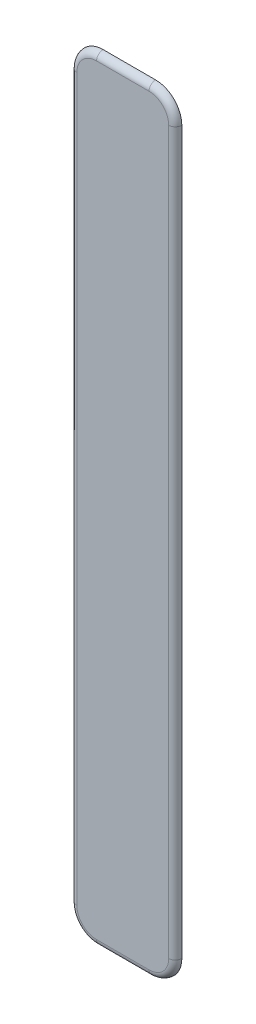
ISO-10303-21;
HEADER;
FILE_DESCRIPTION(('STEP AP214'),'2;1');
FILE_NAME('part.step','',(''),(''),'','','');
FILE_SCHEMA(('AUTOMOTIVE_DESIGN { 1 0 10303 214 1 1 1 1 }'));
ENDSEC;
DATA;
#1=APPLICATION_CONTEXT('core data for automotive mechanical design processes');
#2=APPLICATION_PROTOCOL_DEFINITION('international standard','automotive_design',2000,#1);
#3=PRODUCT_CONTEXT('',#1,'mechanical');
#4=PRODUCT('Part','Part','',(#3));
#5=PRODUCT_RELATED_PRODUCT_CATEGORY('part','',(#4));
#6=PRODUCT_DEFINITION_FORMATION('','',#4);
#7=PRODUCT_DEFINITION_CONTEXT('part definition',#1,'design');
#8=PRODUCT_DEFINITION('design','',#6,#7);
#9=PRODUCT_DEFINITION_SHAPE('','',#8);
#10=(LENGTH_UNIT() NAMED_UNIT(*) SI_UNIT(.MILLI.,.METRE.));
#11=(NAMED_UNIT(*) PLANE_ANGLE_UNIT() SI_UNIT($,.RADIAN.));
#12=(NAMED_UNIT(*) SI_UNIT($,.STERADIAN.) SOLID_ANGLE_UNIT());
#13=UNCERTAINTY_MEASURE_WITH_UNIT(LENGTH_MEASURE(1.E-05),#10,'distance_accuracy_value','');
#14=(GEOMETRIC_REPRESENTATION_CONTEXT(3) GLOBAL_UNCERTAINTY_ASSIGNED_CONTEXT((#13)) GLOBAL_UNIT_ASSIGNED_CONTEXT((#10,
#11,#12)) REPRESENTATION_CONTEXT('',''));
#15=CARTESIAN_POINT('',(0.,0.,0.));
#16=DIRECTION('',(0.,0.,1.));
#17=DIRECTION('',(1.,0.,0.));
#18=AXIS2_PLACEMENT_3D('',#15,#16,#17);
#19=CARTESIAN_POINT('',(0.,0.,1.));
#20=DIRECTION('',(0.,0.,-1.));
#21=DIRECTION('',(-1.,0.,0.));
#22=AXIS2_PLACEMENT_3D('',#19,#20,#21);
#23=PLANE('',#22);
#24=DIRECTION('',(-1.,0.,0.));
#25=VECTOR('',#24,1.);
#26=CARTESIAN_POINT('',(0.,117.,1.));
#27=LINE('',#26,#25);
#28=CARTESIAN_POINT('',(12.,117.,1.));
#29=VERTEX_POINT('',#28);
#30=CARTESIAN_POINT('',(4.,117.,1.));
#31=VERTEX_POINT('',#30);
#32=EDGE_CURVE('E44',#29,#31,#27,.T.);
#33=ORIENTED_EDGE('',*,*,#32,.T.);
#34=CARTESIAN_POINT('',(4.,114.,1.));
#35=DIRECTION('',(0.,0.,-1.));
#36=DIRECTION('',(-1.,0.,0.));
#37=AXIS2_PLACEMENT_3D('',#34,#35,#36);
#38=CIRCLE('',#37,3.);
#39=CARTESIAN_POINT('',(1.,114.,1.));
#40=VERTEX_POINT('',#39);
#41=EDGE_CURVE('E11',#31,#40,#38,.F.);
#42=ORIENTED_EDGE('',*,*,#41,.T.);
#43=DIRECTION('',(0.,-1.,0.));
#44=VECTOR('',#43,1.);
#45=CARTESIAN_POINT('',(1.,0.,1.));
#46=LINE('',#45,#44);
#47=CARTESIAN_POINT('',(1.,4.,1.));
#48=VERTEX_POINT('',#47);
#49=EDGE_CURVE('E127',#40,#48,#46,.T.);
#50=ORIENTED_EDGE('',*,*,#49,.T.);
#51=CARTESIAN_POINT('',(4.,4.,1.));
#52=DIRECTION('',(0.,0.,-1.));
#53=DIRECTION('',(-1.,0.,0.));
#54=AXIS2_PLACEMENT_3D('',#51,#52,#53);
#55=CIRCLE('',#54,3.);
#56=CARTESIAN_POINT('',(4.,1.,1.));
#57=VERTEX_POINT('',#56);
#58=EDGE_CURVE('E129',#48,#57,#55,.F.);
#59=ORIENTED_EDGE('',*,*,#58,.T.);
#60=DIRECTION('',(1.,0.,0.));
#61=VECTOR('',#60,1.);
#62=CARTESIAN_POINT('',(0.,1.,1.));
#63=LINE('',#62,#61);
#64=CARTESIAN_POINT('',(12.,1.,1.));
#65=VERTEX_POINT('',#64);
#66=EDGE_CURVE('E117',#57,#65,#63,.T.);
#67=ORIENTED_EDGE('',*,*,#66,.T.);
#68=CARTESIAN_POINT('',(12.,4.,1.));
#69=DIRECTION('',(0.,0.,-1.));
#70=DIRECTION('',(-1.,0.,0.));
#71=AXIS2_PLACEMENT_3D('',#68,#69,#70);
#72=CIRCLE('',#71,3.);
#73=CARTESIAN_POINT('',(15.,4.,1.));
#74=VERTEX_POINT('',#73);
#75=EDGE_CURVE('E137',#65,#74,#72,.F.);
#76=ORIENTED_EDGE('',*,*,#75,.T.);
#77=DIRECTION('',(0.,1.,0.));
#78=VECTOR('',#77,1.);
#79=CARTESIAN_POINT('',(15.,0.,1.));
#80=LINE('',#79,#78);
#81=CARTESIAN_POINT('',(15.,114.,1.));
#82=VERTEX_POINT('',#81);
#83=EDGE_CURVE('E139',#74,#82,#80,.T.);
#84=ORIENTED_EDGE('',*,*,#83,.T.);
#85=CARTESIAN_POINT('',(12.,114.,1.));
#86=DIRECTION('',(0.,0.,-1.));
#87=DIRECTION('',(-1.,0.,0.));
#88=AXIS2_PLACEMENT_3D('',#85,#86,#87);
#89=CIRCLE('',#88,3.);
#90=EDGE_CURVE('E55',#82,#29,#89,.F.);
#91=ORIENTED_EDGE('',*,*,#90,.T.);
#92=EDGE_LOOP('',(#33,#42,#50,#59,#67,#76,#84,#91));
#93=FACE_BOUND('',#92,.T.);
#94=ADVANCED_FACE('F35',(#93),#23,.F.);
#95=CARTESIAN_POINT('',(0.,0.,0.));
#96=DIRECTION('',(0.,0.,-1.));
#97=DIRECTION('',(-1.,0.,0.));
#98=AXIS2_PLACEMENT_3D('',#95,#96,#97);
#99=PLANE('',#98);
#100=DIRECTION('',(1.,0.,0.));
#101=VECTOR('',#100,1.);
#102=CARTESIAN_POINT('',(0.,0.,0.));
#103=LINE('',#102,#101);
#104=CARTESIAN_POINT('',(4.,0.,0.));
#105=VERTEX_POINT('',#104);
#106=CARTESIAN_POINT('',(12.,0.,0.));
#107=VERTEX_POINT('',#106);
#108=EDGE_CURVE('E99',#105,#107,#103,.T.);
#109=ORIENTED_EDGE('',*,*,#108,.F.);
#110=CARTESIAN_POINT('',(4.,4.,0.));
#111=DIRECTION('',(0.,0.,-1.));
#112=DIRECTION('',(-1.,0.,0.));
#113=AXIS2_PLACEMENT_3D('',#110,#111,#112);
#114=CIRCLE('',#113,4.);
#115=CARTESIAN_POINT('',(0.,4.,0.));
#116=VERTEX_POINT('',#115);
#117=EDGE_CURVE('E103',#105,#116,#114,.T.);
#118=ORIENTED_EDGE('',*,*,#117,.T.);
#119=DIRECTION('',(0.,-1.,0.));
#120=VECTOR('',#119,1.);
#121=CARTESIAN_POINT('',(0.,0.,0.));
#122=LINE('',#121,#120);
#123=CARTESIAN_POINT('',(0.,114.,0.));
#124=VERTEX_POINT('',#123);
#125=EDGE_CURVE('E111',#124,#116,#122,.T.);
#126=ORIENTED_EDGE('',*,*,#125,.F.);
#127=CARTESIAN_POINT('',(4.,114.,0.));
#128=DIRECTION('',(0.,0.,-1.));
#129=DIRECTION('',(-1.,0.,0.));
#130=AXIS2_PLACEMENT_3D('',#127,#128,#129);
#131=CIRCLE('',#130,4.);
#132=CARTESIAN_POINT('',(4.,118.,0.));
#133=VERTEX_POINT('',#132);
#134=EDGE_CURVE('E131',#124,#133,#131,.T.);
#135=ORIENTED_EDGE('',*,*,#134,.T.);
#136=DIRECTION('',(-1.,0.,0.));
#137=VECTOR('',#136,1.);
#138=CARTESIAN_POINT('',(0.,118.,0.));
#139=LINE('',#138,#137);
#140=CARTESIAN_POINT('',(12.,118.,0.));
#141=VERTEX_POINT('',#140);
#142=EDGE_CURVE('E162',#141,#133,#139,.T.);
#143=ORIENTED_EDGE('',*,*,#142,.F.);
#144=CARTESIAN_POINT('',(12.,114.,0.));
#145=DIRECTION('',(0.,0.,-1.));
#146=DIRECTION('',(-1.,0.,0.));
#147=AXIS2_PLACEMENT_3D('',#144,#145,#146);
#148=CIRCLE('',#147,4.);
#149=CARTESIAN_POINT('',(16.,114.,0.));
#150=VERTEX_POINT('',#149);
#151=EDGE_CURVE('E165',#141,#150,#148,.T.);
#152=ORIENTED_EDGE('',*,*,#151,.T.);
#153=DIRECTION('',(0.,1.,0.));
#154=VECTOR('',#153,1.);
#155=CARTESIAN_POINT('',(16.,0.,0.));
#156=LINE('',#155,#154);
#157=CARTESIAN_POINT('',(16.,4.,0.));
#158=VERTEX_POINT('',#157);
#159=EDGE_CURVE('E110',#158,#150,#156,.T.);
#160=ORIENTED_EDGE('',*,*,#159,.F.);
#161=CARTESIAN_POINT('',(12.,4.,0.));
#162=DIRECTION('',(0.,0.,-1.));
#163=DIRECTION('',(-1.,0.,0.));
#164=AXIS2_PLACEMENT_3D('',#161,#162,#163);
#165=CIRCLE('',#164,4.);
#166=EDGE_CURVE('E106',#158,#107,#165,.T.);
#167=ORIENTED_EDGE('',*,*,#166,.T.);
#168=EDGE_LOOP('',(#109,#118,#126,#135,#143,#152,#160,#167));
#169=FACE_BOUND('',#168,.T.);
#170=ADVANCED_FACE('F101',(#169),#99,.T.);
#171=CARTESIAN_POINT('',(12.,4.,0.));
#172=DIRECTION('',(0.,0.,-1.));
#173=DIRECTION('',(-1.,0.,0.));
#174=AXIS2_PLACEMENT_3D('',#171,#172,#173);
#175=TOROIDAL_SURFACE('',#174,3.,1.);
#176=CARTESIAN_POINT('',(12.,1.,0.));
#177=DIRECTION('',(-1.,0.,0.));
#178=DIRECTION('',(0.,0.,1.));
#179=AXIS2_PLACEMENT_3D('',#176,#177,#178);
#180=CIRCLE('',#179,1.);
#181=EDGE_CURVE('E151',#107,#65,#180,.T.);
#182=ORIENTED_EDGE('',*,*,#181,.F.);
#183=ORIENTED_EDGE('',*,*,#166,.F.);
#184=CARTESIAN_POINT('',(15.,4.,0.));
#185=DIRECTION('',(0.,1.,0.));
#186=DIRECTION('',(0.,0.,1.));
#187=AXIS2_PLACEMENT_3D('',#184,#185,#186);
#188=CIRCLE('',#187,1.);
#189=EDGE_CURVE('E39',#74,#158,#188,.T.);
#190=ORIENTED_EDGE('',*,*,#189,.F.);
#191=ORIENTED_EDGE('',*,*,#75,.F.);
#192=EDGE_LOOP('',(#182,#183,#190,#191));
#193=FACE_BOUND('',#192,.T.);
#194=ADVANCED_FACE('F37',(#193),#175,.T.);
#195=CARTESIAN_POINT('',(15.,0.,0.));
#196=DIRECTION('',(0.,1.,0.));
#197=DIRECTION('',(0.,0.,1.));
#198=AXIS2_PLACEMENT_3D('',#195,#196,#197);
#199=CYLINDRICAL_SURFACE('',#198,1.);
#200=ORIENTED_EDGE('',*,*,#189,.T.);
#201=ORIENTED_EDGE('',*,*,#159,.T.);
#202=CARTESIAN_POINT('',(15.,114.,0.));
#203=DIRECTION('',(0.,1.,0.));
#204=DIRECTION('',(0.,0.,1.));
#205=AXIS2_PLACEMENT_3D('',#202,#203,#204);
#206=CIRCLE('',#205,1.);
#207=EDGE_CURVE('E120',#82,#150,#206,.T.);
#208=ORIENTED_EDGE('',*,*,#207,.F.);
#209=ORIENTED_EDGE('',*,*,#83,.F.);
#210=EDGE_LOOP('',(#200,#201,#208,#209));
#211=FACE_BOUND('',#210,.T.);
#212=ADVANCED_FACE('F196',(#211),#199,.T.);
#213=CARTESIAN_POINT('',(0.,1.,0.));
#214=DIRECTION('',(1.,0.,0.));
#215=DIRECTION('',(0.,0.,-1.));
#216=AXIS2_PLACEMENT_3D('',#213,#214,#215);
#217=CYLINDRICAL_SURFACE('',#216,1.);
#218=ORIENTED_EDGE('',*,*,#181,.T.);
#219=ORIENTED_EDGE('',*,*,#66,.F.);
#220=CARTESIAN_POINT('',(4.,1.,0.));
#221=DIRECTION('',(-1.,0.,0.));
#222=DIRECTION('',(0.,0.,1.));
#223=AXIS2_PLACEMENT_3D('',#220,#221,#222);
#224=CIRCLE('',#223,1.);
#225=EDGE_CURVE('E115',#105,#57,#224,.T.);
#226=ORIENTED_EDGE('',*,*,#225,.F.);
#227=ORIENTED_EDGE('',*,*,#108,.T.);
#228=EDGE_LOOP('',(#218,#219,#226,#227));
#229=FACE_BOUND('',#228,.T.);
#230=ADVANCED_FACE('F116',(#229),#217,.T.);
#231=CARTESIAN_POINT('',(12.,114.,0.));
#232=DIRECTION('',(0.,0.,-1.));
#233=DIRECTION('',(-1.,0.,0.));
#234=AXIS2_PLACEMENT_3D('',#231,#232,#233);
#235=TOROIDAL_SURFACE('',#234,3.,1.);
#236=ORIENTED_EDGE('',*,*,#207,.T.);
#237=ORIENTED_EDGE('',*,*,#151,.F.);
#238=CARTESIAN_POINT('',(12.,117.,0.));
#239=DIRECTION('',(-1.,0.,0.));
#240=DIRECTION('',(0.,0.,1.));
#241=AXIS2_PLACEMENT_3D('',#238,#239,#240);
#242=CIRCLE('',#241,1.);
#243=EDGE_CURVE('E121',#29,#141,#242,.T.);
#244=ORIENTED_EDGE('',*,*,#243,.F.);
#245=ORIENTED_EDGE('',*,*,#90,.F.);
#246=EDGE_LOOP('',(#236,#237,#244,#245));
#247=FACE_BOUND('',#246,.T.);
#248=ADVANCED_FACE('F191',(#247),#235,.T.);
#249=CARTESIAN_POINT('',(4.,4.,0.));
#250=DIRECTION('',(0.,0.,-1.));
#251=DIRECTION('',(-1.,0.,0.));
#252=AXIS2_PLACEMENT_3D('',#249,#250,#251);
#253=TOROIDAL_SURFACE('',#252,3.,1.);
#254=ORIENTED_EDGE('',*,*,#225,.T.);
#255=ORIENTED_EDGE('',*,*,#58,.F.);
#256=CARTESIAN_POINT('',(1.,4.,0.));
#257=DIRECTION('',(0.,1.,0.));
#258=DIRECTION('',(0.,0.,1.));
#259=AXIS2_PLACEMENT_3D('',#256,#257,#258);
#260=CIRCLE('',#259,1.);
#261=EDGE_CURVE('E125',#116,#48,#260,.T.);
#262=ORIENTED_EDGE('',*,*,#261,.F.);
#263=ORIENTED_EDGE('',*,*,#117,.F.);
#264=EDGE_LOOP('',(#254,#255,#262,#263));
#265=FACE_BOUND('',#264,.T.);
#266=ADVANCED_FACE('F123',(#265),#253,.T.);
#267=CARTESIAN_POINT('',(0.,117.,0.));
#268=DIRECTION('',(-1.,0.,0.));
#269=DIRECTION('',(0.,0.,1.));
#270=AXIS2_PLACEMENT_3D('',#267,#268,#269);
#271=CYLINDRICAL_SURFACE('',#270,1.);
#272=ORIENTED_EDGE('',*,*,#243,.T.);
#273=ORIENTED_EDGE('',*,*,#142,.T.);
#274=CARTESIAN_POINT('',(4.,117.,0.));
#275=DIRECTION('',(-1.,0.,0.));
#276=DIRECTION('',(0.,0.,1.));
#277=AXIS2_PLACEMENT_3D('',#274,#275,#276);
#278=CIRCLE('',#277,1.);
#279=EDGE_CURVE('E145',#31,#133,#278,.T.);
#280=ORIENTED_EDGE('',*,*,#279,.F.);
#281=ORIENTED_EDGE('',*,*,#32,.F.);
#282=EDGE_LOOP('',(#272,#273,#280,#281));
#283=FACE_BOUND('',#282,.T.);
#284=ADVANCED_FACE('F185',(#283),#271,.T.);
#285=CARTESIAN_POINT('',(1.,0.,0.));
#286=DIRECTION('',(0.,-1.,0.));
#287=DIRECTION('',(0.,0.,-1.));
#288=AXIS2_PLACEMENT_3D('',#285,#286,#287);
#289=CYLINDRICAL_SURFACE('',#288,1.);
#290=ORIENTED_EDGE('',*,*,#261,.T.);
#291=ORIENTED_EDGE('',*,*,#49,.F.);
#292=CARTESIAN_POINT('',(1.,114.,0.));
#293=DIRECTION('',(0.,1.,0.));
#294=DIRECTION('',(0.,0.,1.));
#295=AXIS2_PLACEMENT_3D('',#292,#293,#294);
#296=CIRCLE('',#295,1.);
#297=EDGE_CURVE('E143',#124,#40,#296,.T.);
#298=ORIENTED_EDGE('',*,*,#297,.F.);
#299=ORIENTED_EDGE('',*,*,#125,.T.);
#300=EDGE_LOOP('',(#290,#291,#298,#299));
#301=FACE_BOUND('',#300,.T.);
#302=ADVANCED_FACE('F173',(#301),#289,.T.);
#303=CARTESIAN_POINT('',(4.,114.,0.));
#304=DIRECTION('',(0.,0.,-1.));
#305=DIRECTION('',(-1.,0.,0.));
#306=AXIS2_PLACEMENT_3D('',#303,#304,#305);
#307=TOROIDAL_SURFACE('',#306,3.,1.);
#308=ORIENTED_EDGE('',*,*,#279,.T.);
#309=ORIENTED_EDGE('',*,*,#134,.F.);
#310=ORIENTED_EDGE('',*,*,#297,.T.);
#311=ORIENTED_EDGE('',*,*,#41,.F.);
#312=EDGE_LOOP('',(#308,#309,#310,#311));
#313=FACE_BOUND('',#312,.T.);
#314=ADVANCED_FACE('F170',(#313),#307,.T.);
#315=CLOSED_SHELL('',(#94,#170,#194,#212,#230,#248,#266,#284,#302,#314));
#316=MANIFOLD_SOLID_BREP('B2',#315);
#317=ADVANCED_BREP_SHAPE_REPRESENTATION('',(#18,#316),#14);
#318=SHAPE_DEFINITION_REPRESENTATION(#9,#317);
ENDSEC;
END-ISO-10303-21;
